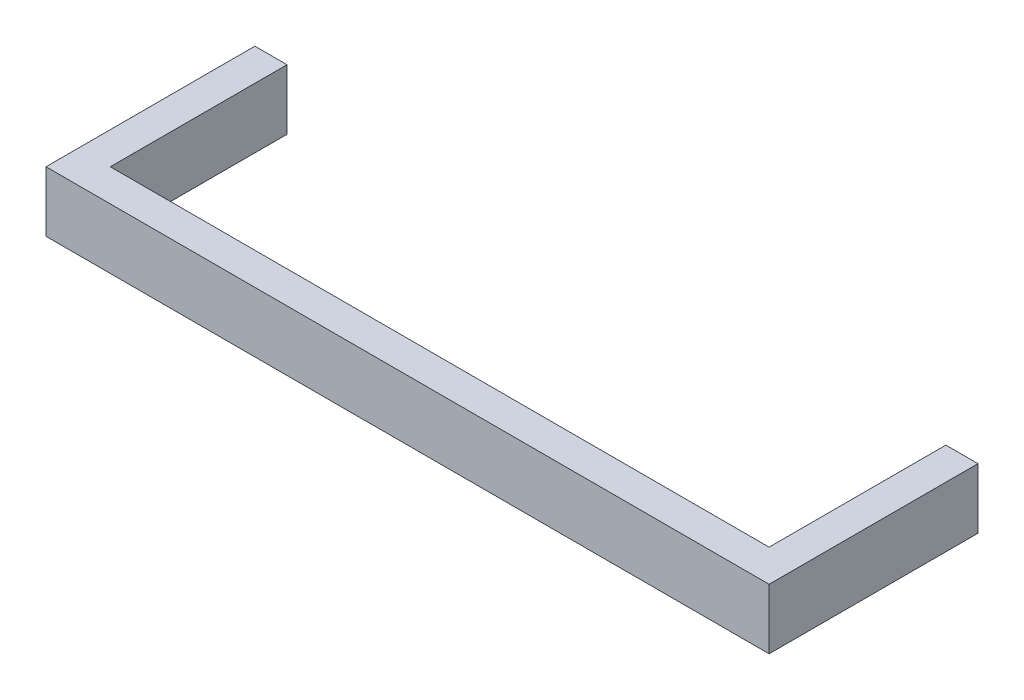
ISO-10303-21;
HEADER;
FILE_DESCRIPTION(('STEP AP214'),'2;1');
FILE_NAME('part.step','',(''),(''),'','','');
FILE_SCHEMA(('AUTOMOTIVE_DESIGN { 1 0 10303 214 1 1 1 1 }'));
ENDSEC;
DATA;
#1=APPLICATION_CONTEXT('core data for automotive mechanical design processes');
#2=APPLICATION_PROTOCOL_DEFINITION('international standard','automotive_design',2000,#1);
#3=PRODUCT_CONTEXT('',#1,'mechanical');
#4=PRODUCT('Part','Part','',(#3));
#5=PRODUCT_RELATED_PRODUCT_CATEGORY('part','',(#4));
#6=PRODUCT_DEFINITION_FORMATION('','',#4);
#7=PRODUCT_DEFINITION_CONTEXT('part definition',#1,'design');
#8=PRODUCT_DEFINITION('design','',#6,#7);
#9=PRODUCT_DEFINITION_SHAPE('','',#8);
#10=(LENGTH_UNIT() NAMED_UNIT(*) SI_UNIT(.MILLI.,.METRE.));
#11=(NAMED_UNIT(*) PLANE_ANGLE_UNIT() SI_UNIT($,.RADIAN.));
#12=(NAMED_UNIT(*) SI_UNIT($,.STERADIAN.) SOLID_ANGLE_UNIT());
#13=UNCERTAINTY_MEASURE_WITH_UNIT(LENGTH_MEASURE(1.E-05),#10,'distance_accuracy_value','');
#14=(GEOMETRIC_REPRESENTATION_CONTEXT(3) GLOBAL_UNCERTAINTY_ASSIGNED_CONTEXT((#13)) GLOBAL_UNIT_ASSIGNED_CONTEXT((#10,
#11,#12)) REPRESENTATION_CONTEXT('',''));
#15=CARTESIAN_POINT('',(0.,0.,0.));
#16=DIRECTION('',(0.,0.,1.));
#17=DIRECTION('',(1.,0.,0.));
#18=AXIS2_PLACEMENT_3D('',#15,#16,#17);
#19=CARTESIAN_POINT('',(26.4113451602028,3.75,-39.0193900496955));
#20=DIRECTION('',(-1.,0.,0.));
#21=DIRECTION('',(0.,0.,1.));
#22=AXIS2_PLACEMENT_3D('',#19,#20,#21);
#23=PLANE('',#22);
#24=DIRECTION('',(0.,0.,-1.));
#25=VECTOR('',#24,1.);
#26=CARTESIAN_POINT('',(26.4113451602028,0.,-39.0193900496955));
#27=LINE('',#26,#25);
#28=CARTESIAN_POINT('',(26.4113451602028,0.,-26.0193900496955));
#29=VERTEX_POINT('',#28);
#30=CARTESIAN_POINT('',(26.4113451602028,0.,-39.0193900496955));
#31=VERTEX_POINT('',#30);
#32=EDGE_CURVE('E135',#29,#31,#27,.T.);
#33=ORIENTED_EDGE('',*,*,#32,.T.);
#34=DIRECTION('',(0.,-1.,0.));
#35=VECTOR('',#34,1.);
#36=CARTESIAN_POINT('',(26.4113451602028,3.75,-39.0193900496955));
#37=LINE('',#36,#35);
#38=CARTESIAN_POINT('',(26.4113451602028,3.75,-39.0193900496955));
#39=VERTEX_POINT('',#38);
#40=EDGE_CURVE('E11',#39,#31,#37,.T.);
#41=ORIENTED_EDGE('',*,*,#40,.F.);
#42=DIRECTION('',(0.,0.,-1.));
#43=VECTOR('',#42,1.);
#44=CARTESIAN_POINT('',(26.4113451602028,3.75,-39.0193900496955));
#45=LINE('',#44,#43);
#46=CARTESIAN_POINT('',(26.4113451602028,3.75,-26.0193900496955));
#47=VERTEX_POINT('',#46);
#48=EDGE_CURVE('E149',#47,#39,#45,.T.);
#49=ORIENTED_EDGE('',*,*,#48,.F.);
#50=DIRECTION('',(0.,-1.,0.));
#51=VECTOR('',#50,1.);
#52=CARTESIAN_POINT('',(26.4113451602028,3.75,-26.0193900496955));
#53=LINE('',#52,#51);
#54=EDGE_CURVE('E131',#47,#29,#53,.T.);
#55=ORIENTED_EDGE('',*,*,#54,.T.);
#56=EDGE_LOOP('',(#33,#41,#49,#55));
#57=FACE_BOUND('',#56,.T.);
#58=ADVANCED_FACE('F39',(#57),#23,.F.);
#59=CARTESIAN_POINT('',(24.4113451602028,3.75,-39.0193900496955));
#60=DIRECTION('',(0.,0.,1.));
#61=DIRECTION('',(1.,0.,0.));
#62=AXIS2_PLACEMENT_3D('',#59,#60,#61);
#63=PLANE('',#62);
#64=DIRECTION('',(-1.,0.,0.));
#65=VECTOR('',#64,1.);
#66=CARTESIAN_POINT('',(24.4113451602028,0.,-39.0193900496955));
#67=LINE('',#66,#65);
#68=CARTESIAN_POINT('',(24.4113451602028,0.,-39.0193900496955));
#69=VERTEX_POINT('',#68);
#70=EDGE_CURVE('E138',#31,#69,#67,.T.);
#71=ORIENTED_EDGE('',*,*,#70,.T.);
#72=DIRECTION('',(0.,-1.,0.));
#73=VECTOR('',#72,1.);
#74=CARTESIAN_POINT('',(24.4113451602028,3.75,-39.0193900496955));
#75=LINE('',#74,#73);
#76=CARTESIAN_POINT('',(24.4113451602028,3.75,-39.0193900496955));
#77=VERTEX_POINT('',#76);
#78=EDGE_CURVE('E47',#77,#69,#75,.T.);
#79=ORIENTED_EDGE('',*,*,#78,.F.);
#80=DIRECTION('',(-1.,0.,0.));
#81=VECTOR('',#80,1.);
#82=CARTESIAN_POINT('',(24.4113451602028,3.75,-39.0193900496955));
#83=LINE('',#82,#81);
#84=EDGE_CURVE('E98',#39,#77,#83,.T.);
#85=ORIENTED_EDGE('',*,*,#84,.F.);
#86=ORIENTED_EDGE('',*,*,#40,.T.);
#87=EDGE_LOOP('',(#71,#79,#85,#86));
#88=FACE_BOUND('',#87,.T.);
#89=ADVANCED_FACE('F184',(#88),#63,.F.);
#90=CARTESIAN_POINT('',(24.4113451602028,3.75,-39.0193900496955));
#91=DIRECTION('',(1.,0.,0.));
#92=DIRECTION('',(0.,0.,-1.));
#93=AXIS2_PLACEMENT_3D('',#90,#91,#92);
#94=PLANE('',#93);
#95=DIRECTION('',(0.,0.,1.));
#96=VECTOR('',#95,1.);
#97=CARTESIAN_POINT('',(24.4113451602028,0.,-39.0193900496955));
#98=LINE('',#97,#96);
#99=CARTESIAN_POINT('',(24.4113451602028,0.,-28.0193900496955));
#100=VERTEX_POINT('',#99);
#101=EDGE_CURVE('E140',#69,#100,#98,.T.);
#102=ORIENTED_EDGE('',*,*,#101,.T.);
#103=DIRECTION('',(0.,-1.,0.));
#104=VECTOR('',#103,1.);
#105=CARTESIAN_POINT('',(24.4113451602028,3.75,-28.0193900496955));
#106=LINE('',#105,#104);
#107=CARTESIAN_POINT('',(24.4113451602028,3.75,-28.0193900496955));
#108=VERTEX_POINT('',#107);
#109=EDGE_CURVE('E156',#108,#100,#106,.T.);
#110=ORIENTED_EDGE('',*,*,#109,.F.);
#111=DIRECTION('',(0.,0.,1.));
#112=VECTOR('',#111,1.);
#113=CARTESIAN_POINT('',(24.4113451602028,3.75,-39.0193900496955));
#114=LINE('',#113,#112);
#115=EDGE_CURVE('E164',#77,#108,#114,.T.);
#116=ORIENTED_EDGE('',*,*,#115,.F.);
#117=ORIENTED_EDGE('',*,*,#78,.T.);
#118=EDGE_LOOP('',(#102,#110,#116,#117));
#119=FACE_BOUND('',#118,.T.);
#120=ADVANCED_FACE('F162',(#119),#94,.F.);
#121=CARTESIAN_POINT('',(-16.5886548397972,3.75,-28.0193900496955));
#122=DIRECTION('',(0.,0.,1.));
#123=DIRECTION('',(1.,0.,0.));
#124=AXIS2_PLACEMENT_3D('',#121,#122,#123);
#125=PLANE('',#124);
#126=DIRECTION('',(-1.,0.,0.));
#127=VECTOR('',#126,1.);
#128=CARTESIAN_POINT('',(-16.5886548397972,0.,-28.0193900496955));
#129=LINE('',#128,#127);
#130=CARTESIAN_POINT('',(-16.5886548397972,0.,-28.0193900496955));
#131=VERTEX_POINT('',#130);
#132=EDGE_CURVE('E142',#100,#131,#129,.T.);
#133=ORIENTED_EDGE('',*,*,#132,.T.);
#134=DIRECTION('',(0.,-1.,0.));
#135=VECTOR('',#134,1.);
#136=CARTESIAN_POINT('',(-16.5886548397972,3.75,-28.0193900496955));
#137=LINE('',#136,#135);
#138=CARTESIAN_POINT('',(-16.5886548397972,3.75,-28.0193900496955));
#139=VERTEX_POINT('',#138);
#140=EDGE_CURVE('E153',#139,#131,#137,.T.);
#141=ORIENTED_EDGE('',*,*,#140,.F.);
#142=DIRECTION('',(-1.,0.,0.));
#143=VECTOR('',#142,1.);
#144=CARTESIAN_POINT('',(-16.5886548397972,3.75,-28.0193900496955));
#145=LINE('',#144,#143);
#146=EDGE_CURVE('E176',#108,#139,#145,.T.);
#147=ORIENTED_EDGE('',*,*,#146,.F.);
#148=ORIENTED_EDGE('',*,*,#109,.T.);
#149=EDGE_LOOP('',(#133,#141,#147,#148));
#150=FACE_BOUND('',#149,.T.);
#151=ADVANCED_FACE('F172',(#150),#125,.F.);
#152=CARTESIAN_POINT('',(-16.5886548397972,3.75,-39.0193900496955));
#153=DIRECTION('',(-1.,0.,0.));
#154=DIRECTION('',(0.,0.,1.));
#155=AXIS2_PLACEMENT_3D('',#152,#153,#154);
#156=PLANE('',#155);
#157=DIRECTION('',(0.,0.,-1.));
#158=VECTOR('',#157,1.);
#159=CARTESIAN_POINT('',(-16.5886548397972,0.,-39.0193900496955));
#160=LINE('',#159,#158);
#161=CARTESIAN_POINT('',(-16.5886548397972,0.,-39.0193900496955));
#162=VERTEX_POINT('',#161);
#163=EDGE_CURVE('E144',#131,#162,#160,.T.);
#164=ORIENTED_EDGE('',*,*,#163,.T.);
#165=DIRECTION('',(0.,-1.,0.));
#166=VECTOR('',#165,1.);
#167=CARTESIAN_POINT('',(-16.5886548397972,3.75,-39.0193900496955));
#168=LINE('',#167,#166);
#169=CARTESIAN_POINT('',(-16.5886548397972,3.75,-39.0193900496955));
#170=VERTEX_POINT('',#169);
#171=EDGE_CURVE('E126',#170,#162,#168,.T.);
#172=ORIENTED_EDGE('',*,*,#171,.F.);
#173=DIRECTION('',(0.,0.,-1.));
#174=VECTOR('',#173,1.);
#175=CARTESIAN_POINT('',(-16.5886548397972,3.75,-39.0193900496955));
#176=LINE('',#175,#174);
#177=EDGE_CURVE('E117',#139,#170,#176,.T.);
#178=ORIENTED_EDGE('',*,*,#177,.F.);
#179=ORIENTED_EDGE('',*,*,#140,.T.);
#180=EDGE_LOOP('',(#164,#172,#178,#179));
#181=FACE_BOUND('',#180,.T.);
#182=ADVANCED_FACE('F175',(#181),#156,.F.);
#183=CARTESIAN_POINT('',(-16.5886548397972,3.75,-39.0193900496955));
#184=DIRECTION('',(0.,0.,1.));
#185=DIRECTION('',(1.,0.,0.));
#186=AXIS2_PLACEMENT_3D('',#183,#184,#185);
#187=PLANE('',#186);
#188=DIRECTION('',(-1.,0.,0.));
#189=VECTOR('',#188,1.);
#190=CARTESIAN_POINT('',(-16.5886548397972,0.,-39.0193900496955));
#191=LINE('',#190,#189);
#192=CARTESIAN_POINT('',(-18.5886548397972,0.,-39.0193900496955));
#193=VERTEX_POINT('',#192);
#194=EDGE_CURVE('E125',#162,#193,#191,.T.);
#195=ORIENTED_EDGE('',*,*,#194,.T.);
#196=DIRECTION('',(0.,-1.,0.));
#197=VECTOR('',#196,1.);
#198=CARTESIAN_POINT('',(-18.5886548397972,3.75,-39.0193900496955));
#199=LINE('',#198,#197);
#200=CARTESIAN_POINT('',(-18.5886548397972,3.75,-39.0193900496955));
#201=VERTEX_POINT('',#200);
#202=EDGE_CURVE('E122',#201,#193,#199,.T.);
#203=ORIENTED_EDGE('',*,*,#202,.F.);
#204=DIRECTION('',(-1.,0.,0.));
#205=VECTOR('',#204,1.);
#206=CARTESIAN_POINT('',(-16.5886548397972,3.75,-39.0193900496955));
#207=LINE('',#206,#205);
#208=EDGE_CURVE('E111',#170,#201,#207,.T.);
#209=ORIENTED_EDGE('',*,*,#208,.F.);
#210=ORIENTED_EDGE('',*,*,#171,.T.);
#211=EDGE_LOOP('',(#195,#203,#209,#210));
#212=FACE_BOUND('',#211,.T.);
#213=ADVANCED_FACE('F123',(#212),#187,.F.);
#214=CARTESIAN_POINT('',(-18.5886548397972,3.75,-39.0193900496955));
#215=DIRECTION('',(1.,0.,0.));
#216=DIRECTION('',(0.,0.,-1.));
#217=AXIS2_PLACEMENT_3D('',#214,#215,#216);
#218=PLANE('',#217);
#219=DIRECTION('',(0.,0.,1.));
#220=VECTOR('',#219,1.);
#221=CARTESIAN_POINT('',(-18.5886548397972,0.,-39.0193900496955));
#222=LINE('',#221,#220);
#223=CARTESIAN_POINT('',(-18.5886548397972,0.,-26.0193900496955));
#224=VERTEX_POINT('',#223);
#225=EDGE_CURVE('E84',#193,#224,#222,.T.);
#226=ORIENTED_EDGE('',*,*,#225,.T.);
#227=DIRECTION('',(0.,-1.,0.));
#228=VECTOR('',#227,1.);
#229=CARTESIAN_POINT('',(-18.5886548397972,3.75,-26.0193900496955));
#230=LINE('',#229,#228);
#231=CARTESIAN_POINT('',(-18.5886548397972,3.75,-26.0193900496955));
#232=VERTEX_POINT('',#231);
#233=EDGE_CURVE('E127',#232,#224,#230,.T.);
#234=ORIENTED_EDGE('',*,*,#233,.F.);
#235=DIRECTION('',(0.,0.,1.));
#236=VECTOR('',#235,1.);
#237=CARTESIAN_POINT('',(-18.5886548397972,3.75,-39.0193900496955));
#238=LINE('',#237,#236);
#239=EDGE_CURVE('E115',#201,#232,#238,.T.);
#240=ORIENTED_EDGE('',*,*,#239,.F.);
#241=ORIENTED_EDGE('',*,*,#202,.T.);
#242=EDGE_LOOP('',(#226,#234,#240,#241));
#243=FACE_BOUND('',#242,.T.);
#244=ADVANCED_FACE('F129',(#243),#218,.F.);
#245=CARTESIAN_POINT('',(-18.5886548397972,3.75,-26.0193900496955));
#246=DIRECTION('',(0.,0.,-1.));
#247=DIRECTION('',(-1.,0.,0.));
#248=AXIS2_PLACEMENT_3D('',#245,#246,#247);
#249=PLANE('',#248);
#250=DIRECTION('',(1.,0.,0.));
#251=VECTOR('',#250,1.);
#252=CARTESIAN_POINT('',(-18.5886548397972,0.,-26.0193900496955));
#253=LINE('',#252,#251);
#254=EDGE_CURVE('E90',#224,#29,#253,.T.);
#255=ORIENTED_EDGE('',*,*,#254,.T.);
#256=ORIENTED_EDGE('',*,*,#54,.F.);
#257=DIRECTION('',(1.,0.,0.));
#258=VECTOR('',#257,1.);
#259=CARTESIAN_POINT('',(-18.5886548397972,3.75,-26.0193900496955));
#260=LINE('',#259,#258);
#261=EDGE_CURVE('E55',#232,#47,#260,.T.);
#262=ORIENTED_EDGE('',*,*,#261,.F.);
#263=ORIENTED_EDGE('',*,*,#233,.T.);
#264=EDGE_LOOP('',(#255,#256,#262,#263));
#265=FACE_BOUND('',#264,.T.);
#266=ADVANCED_FACE('F200',(#265),#249,.F.);
#267=CARTESIAN_POINT('',(0.,3.75,0.));
#268=DIRECTION('',(0.,1.,0.));
#269=DIRECTION('',(0.,0.,1.));
#270=AXIS2_PLACEMENT_3D('',#267,#268,#269);
#271=PLANE('',#270);
#272=ORIENTED_EDGE('',*,*,#48,.T.);
#273=ORIENTED_EDGE('',*,*,#84,.T.);
#274=ORIENTED_EDGE('',*,*,#115,.T.);
#275=ORIENTED_EDGE('',*,*,#146,.T.);
#276=ORIENTED_EDGE('',*,*,#177,.T.);
#277=ORIENTED_EDGE('',*,*,#208,.T.);
#278=ORIENTED_EDGE('',*,*,#239,.T.);
#279=ORIENTED_EDGE('',*,*,#261,.T.);
#280=EDGE_LOOP('',(#272,#273,#274,#275,#276,#277,#278,#279));
#281=FACE_BOUND('',#280,.T.);
#282=ADVANCED_FACE('F113',(#281),#271,.T.);
#283=CARTESIAN_POINT('',(0.,0.,0.));
#284=DIRECTION('',(0.,1.,0.));
#285=DIRECTION('',(0.,0.,1.));
#286=AXIS2_PLACEMENT_3D('',#283,#284,#285);
#287=PLANE('',#286);
#288=ORIENTED_EDGE('',*,*,#32,.F.);
#289=ORIENTED_EDGE('',*,*,#254,.F.);
#290=ORIENTED_EDGE('',*,*,#225,.F.);
#291=ORIENTED_EDGE('',*,*,#194,.F.);
#292=ORIENTED_EDGE('',*,*,#163,.F.);
#293=ORIENTED_EDGE('',*,*,#132,.F.);
#294=ORIENTED_EDGE('',*,*,#101,.F.);
#295=ORIENTED_EDGE('',*,*,#70,.F.);
#296=EDGE_LOOP('',(#288,#289,#290,#291,#292,#293,#294,#295));
#297=FACE_BOUND('',#296,.T.);
#298=ADVANCED_FACE('F168',(#297),#287,.F.);
#299=CLOSED_SHELL('',(#58,#89,#120,#151,#182,#213,#244,#266,#282,#298));
#300=MANIFOLD_SOLID_BREP('B2',#299);
#301=ADVANCED_BREP_SHAPE_REPRESENTATION('',(#18,#300),#14);
#302=SHAPE_DEFINITION_REPRESENTATION(#9,#301);
ENDSEC;
END-ISO-10303-21;
